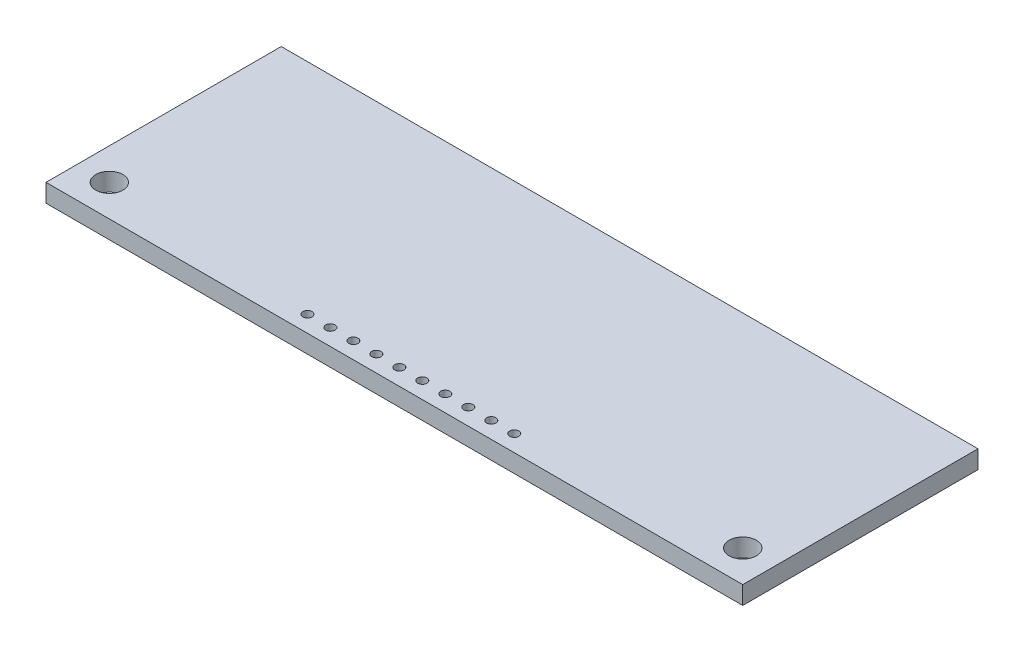
ISO-10303-21;
HEADER;
FILE_DESCRIPTION(('STEP AP214'),'2;1');
FILE_NAME('part.step','',(''),(''),'','','');
FILE_SCHEMA(('AUTOMOTIVE_DESIGN { 1 0 10303 214 1 1 1 1 }'));
ENDSEC;
DATA;
#1=APPLICATION_CONTEXT('core data for automotive mechanical design processes');
#2=APPLICATION_PROTOCOL_DEFINITION('international standard','automotive_design',2000,#1);
#3=PRODUCT_CONTEXT('',#1,'mechanical');
#4=PRODUCT('Part','Part','',(#3));
#5=PRODUCT_RELATED_PRODUCT_CATEGORY('part','',(#4));
#6=PRODUCT_DEFINITION_FORMATION('','',#4);
#7=PRODUCT_DEFINITION_CONTEXT('part definition',#1,'design');
#8=PRODUCT_DEFINITION('design','',#6,#7);
#9=PRODUCT_DEFINITION_SHAPE('','',#8);
#10=(LENGTH_UNIT() NAMED_UNIT(*) SI_UNIT(.MILLI.,.METRE.));
#11=(NAMED_UNIT(*) PLANE_ANGLE_UNIT() SI_UNIT($,.RADIAN.));
#12=(NAMED_UNIT(*) SI_UNIT($,.STERADIAN.) SOLID_ANGLE_UNIT());
#13=UNCERTAINTY_MEASURE_WITH_UNIT(LENGTH_MEASURE(1.E-05),#10,'distance_accuracy_value','');
#14=(GEOMETRIC_REPRESENTATION_CONTEXT(3) GLOBAL_UNCERTAINTY_ASSIGNED_CONTEXT((#13)) GLOBAL_UNIT_ASSIGNED_CONTEXT((#10,
#11,#12)) REPRESENTATION_CONTEXT('',''));
#15=CARTESIAN_POINT('',(0.,0.,0.));
#16=DIRECTION('',(0.,0.,1.));
#17=DIRECTION('',(1.,0.,0.));
#18=AXIS2_PLACEMENT_3D('',#15,#16,#17);
#19=CARTESIAN_POINT('',(0.,2.,26.));
#20=DIRECTION('',(1.,0.,0.));
#21=DIRECTION('',(0.,0.,-1.));
#22=AXIS2_PLACEMENT_3D('',#19,#20,#21);
#23=PLANE('',#22);
#24=DIRECTION('',(0.,0.,1.));
#25=VECTOR('',#24,1.);
#26=CARTESIAN_POINT('',(0.,0.,26.));
#27=LINE('',#26,#25);
#28=CARTESIAN_POINT('',(0.,0.,0.));
#29=VERTEX_POINT('',#28);
#30=CARTESIAN_POINT('',(0.,0.,26.));
#31=VERTEX_POINT('',#30);
#32=EDGE_CURVE('E102',#29,#31,#27,.T.);
#33=ORIENTED_EDGE('',*,*,#32,.T.);
#34=DIRECTION('',(0.,-1.,0.));
#35=VECTOR('',#34,1.);
#36=CARTESIAN_POINT('',(0.,2.,26.));
#37=LINE('',#36,#35);
#38=CARTESIAN_POINT('',(0.,2.,26.));
#39=VERTEX_POINT('',#38);
#40=EDGE_CURVE('E11',#39,#31,#37,.T.);
#41=ORIENTED_EDGE('',*,*,#40,.F.);
#42=DIRECTION('',(0.,0.,1.));
#43=VECTOR('',#42,1.);
#44=CARTESIAN_POINT('',(0.,2.,26.));
#45=LINE('',#44,#43);
#46=CARTESIAN_POINT('',(0.,2.,0.));
#47=VERTEX_POINT('',#46);
#48=EDGE_CURVE('E90',#47,#39,#45,.T.);
#49=ORIENTED_EDGE('',*,*,#48,.F.);
#50=DIRECTION('',(0.,-1.,0.));
#51=VECTOR('',#50,1.);
#52=CARTESIAN_POINT('',(0.,2.,0.));
#53=LINE('',#52,#51);
#54=EDGE_CURVE('E98',#47,#29,#53,.T.);
#55=ORIENTED_EDGE('',*,*,#54,.T.);
#56=EDGE_LOOP('',(#33,#41,#49,#55));
#57=FACE_BOUND('',#56,.T.);
#58=ADVANCED_FACE('F39',(#57),#23,.F.);
#59=CARTESIAN_POINT('',(77.,2.,26.));
#60=DIRECTION('',(0.,0.,-1.));
#61=DIRECTION('',(-1.,0.,0.));
#62=AXIS2_PLACEMENT_3D('',#59,#60,#61);
#63=PLANE('',#62);
#64=DIRECTION('',(1.,0.,0.));
#65=VECTOR('',#64,1.);
#66=CARTESIAN_POINT('',(77.,0.,26.));
#67=LINE('',#66,#65);
#68=CARTESIAN_POINT('',(77.,0.,26.));
#69=VERTEX_POINT('',#68);
#70=EDGE_CURVE('E94',#31,#69,#67,.T.);
#71=ORIENTED_EDGE('',*,*,#70,.T.);
#72=DIRECTION('',(0.,-1.,0.));
#73=VECTOR('',#72,1.);
#74=CARTESIAN_POINT('',(77.,2.,26.));
#75=LINE('',#74,#73);
#76=CARTESIAN_POINT('',(77.,2.,26.));
#77=VERTEX_POINT('',#76);
#78=EDGE_CURVE('E47',#77,#69,#75,.T.);
#79=ORIENTED_EDGE('',*,*,#78,.F.);
#80=DIRECTION('',(1.,0.,0.));
#81=VECTOR('',#80,1.);
#82=CARTESIAN_POINT('',(77.,2.,26.));
#83=LINE('',#82,#81);
#84=EDGE_CURVE('E85',#39,#77,#83,.T.);
#85=ORIENTED_EDGE('',*,*,#84,.F.);
#86=ORIENTED_EDGE('',*,*,#40,.T.);
#87=EDGE_LOOP('',(#71,#79,#85,#86));
#88=FACE_BOUND('',#87,.T.);
#89=ADVANCED_FACE('F93',(#88),#63,.F.);
#90=CARTESIAN_POINT('',(77.,2.,0.));
#91=DIRECTION('',(-1.,0.,0.));
#92=DIRECTION('',(0.,0.,1.));
#93=AXIS2_PLACEMENT_3D('',#90,#91,#92);
#94=PLANE('',#93);
#95=DIRECTION('',(0.,0.,-1.));
#96=VECTOR('',#95,1.);
#97=CARTESIAN_POINT('',(77.,0.,0.));
#98=LINE('',#97,#96);
#99=CARTESIAN_POINT('',(77.,0.,0.));
#100=VERTEX_POINT('',#99);
#101=EDGE_CURVE('E72',#69,#100,#98,.T.);
#102=ORIENTED_EDGE('',*,*,#101,.T.);
#103=DIRECTION('',(0.,-1.,0.));
#104=VECTOR('',#103,1.);
#105=CARTESIAN_POINT('',(77.,2.,0.));
#106=LINE('',#105,#104);
#107=CARTESIAN_POINT('',(77.,2.,0.));
#108=VERTEX_POINT('',#107);
#109=EDGE_CURVE('E95',#108,#100,#106,.T.);
#110=ORIENTED_EDGE('',*,*,#109,.F.);
#111=DIRECTION('',(0.,0.,-1.));
#112=VECTOR('',#111,1.);
#113=CARTESIAN_POINT('',(77.,2.,0.));
#114=LINE('',#113,#112);
#115=EDGE_CURVE('E88',#77,#108,#114,.T.);
#116=ORIENTED_EDGE('',*,*,#115,.F.);
#117=ORIENTED_EDGE('',*,*,#78,.T.);
#118=EDGE_LOOP('',(#102,#110,#116,#117));
#119=FACE_BOUND('',#118,.T.);
#120=ADVANCED_FACE('F96',(#119),#94,.F.);
#121=CARTESIAN_POINT('',(0.,2.,0.));
#122=DIRECTION('',(0.,0.,1.));
#123=DIRECTION('',(1.,0.,0.));
#124=AXIS2_PLACEMENT_3D('',#121,#122,#123);
#125=PLANE('',#124);
#126=DIRECTION('',(-1.,0.,0.));
#127=VECTOR('',#126,1.);
#128=CARTESIAN_POINT('',(0.,0.,0.));
#129=LINE('',#128,#127);
#130=EDGE_CURVE('E78',#100,#29,#129,.T.);
#131=ORIENTED_EDGE('',*,*,#130,.T.);
#132=ORIENTED_EDGE('',*,*,#54,.F.);
#133=DIRECTION('',(-1.,0.,0.));
#134=VECTOR('',#133,1.);
#135=CARTESIAN_POINT('',(0.,2.,0.));
#136=LINE('',#135,#134);
#137=EDGE_CURVE('E55',#108,#47,#136,.T.);
#138=ORIENTED_EDGE('',*,*,#137,.F.);
#139=ORIENTED_EDGE('',*,*,#109,.T.);
#140=EDGE_LOOP('',(#131,#132,#138,#139));
#141=FACE_BOUND('',#140,.T.);
#142=ADVANCED_FACE('F110',(#141),#125,.F.);
#143=CARTESIAN_POINT('',(0.,2.,0.));
#144=DIRECTION('',(0.,-1.,0.));
#145=DIRECTION('',(0.,0.,-1.));
#146=AXIS2_PLACEMENT_3D('',#143,#144,#145);
#147=PLANE('',#146);
#148=CARTESIAN_POINT('',(27.07,2.,24.1796600292399));
#149=DIRECTION('',(0.,1.,0.));
#150=DIRECTION('',(0.,0.,1.));
#151=AXIS2_PLACEMENT_3D('',#148,#149,#150);
#152=CIRCLE('',#151,0.509999999999999);
#153=CARTESIAN_POINT('',(27.07,2.,24.6896600292399));
#154=VERTEX_POINT('',#153);
#155=EDGE_CURVE('E182',#154,#154,#152,.T.);
#156=ORIENTED_EDGE('',*,*,#155,.F.);
#157=EDGE_LOOP('',(#156));
#158=FACE_BOUND('',#157,.T.);
#159=CARTESIAN_POINT('',(29.61,2.,24.1796600292399));
#160=DIRECTION('',(0.,1.,0.));
#161=DIRECTION('',(0.,0.,1.));
#162=AXIS2_PLACEMENT_3D('',#159,#160,#161);
#163=CIRCLE('',#162,0.509999999999995);
#164=CARTESIAN_POINT('',(29.61,2.,24.6896600292399));
#165=VERTEX_POINT('',#164);
#166=EDGE_CURVE('E176',#165,#165,#163,.T.);
#167=ORIENTED_EDGE('',*,*,#166,.F.);
#168=EDGE_LOOP('',(#167));
#169=FACE_BOUND('',#168,.T.);
#170=CARTESIAN_POINT('',(32.15,2.,24.1796600292399));
#171=DIRECTION('',(0.,1.,0.));
#172=DIRECTION('',(0.,0.,1.));
#173=AXIS2_PLACEMENT_3D('',#170,#171,#172);
#174=CIRCLE('',#173,0.509999999999995);
#175=CARTESIAN_POINT('',(32.15,2.,24.6896600292399));
#176=VERTEX_POINT('',#175);
#177=EDGE_CURVE('E170',#176,#176,#174,.T.);
#178=ORIENTED_EDGE('',*,*,#177,.F.);
#179=EDGE_LOOP('',(#178));
#180=FACE_BOUND('',#179,.T.);
#181=CARTESIAN_POINT('',(34.69,2.,24.1796600292399));
#182=DIRECTION('',(0.,1.,0.));
#183=DIRECTION('',(0.,0.,1.));
#184=AXIS2_PLACEMENT_3D('',#181,#182,#183);
#185=CIRCLE('',#184,0.510000000000003);
#186=CARTESIAN_POINT('',(34.69,2.,24.6896600292399));
#187=VERTEX_POINT('',#186);
#188=EDGE_CURVE('E164',#187,#187,#185,.T.);
#189=ORIENTED_EDGE('',*,*,#188,.F.);
#190=EDGE_LOOP('',(#189));
#191=FACE_BOUND('',#190,.T.);
#192=CARTESIAN_POINT('',(37.23,2.,24.1796600292399));
#193=DIRECTION('',(0.,1.,0.));
#194=DIRECTION('',(0.,0.,1.));
#195=AXIS2_PLACEMENT_3D('',#192,#193,#194);
#196=CIRCLE('',#195,0.509999999999995);
#197=CARTESIAN_POINT('',(37.23,2.,24.6896600292399));
#198=VERTEX_POINT('',#197);
#199=EDGE_CURVE('E158',#198,#198,#196,.T.);
#200=ORIENTED_EDGE('',*,*,#199,.F.);
#201=EDGE_LOOP('',(#200));
#202=FACE_BOUND('',#201,.T.);
#203=CARTESIAN_POINT('',(39.77,2.,24.1796600292399));
#204=DIRECTION('',(0.,1.,0.));
#205=DIRECTION('',(0.,0.,1.));
#206=AXIS2_PLACEMENT_3D('',#203,#204,#205);
#207=CIRCLE('',#206,0.509999999999995);
#208=CARTESIAN_POINT('',(39.77,2.,24.6896600292399));
#209=VERTEX_POINT('',#208);
#210=EDGE_CURVE('E152',#209,#209,#207,.T.);
#211=ORIENTED_EDGE('',*,*,#210,.F.);
#212=EDGE_LOOP('',(#211));
#213=FACE_BOUND('',#212,.T.);
#214=CARTESIAN_POINT('',(42.31,2.,24.1796600292399));
#215=DIRECTION('',(0.,1.,0.));
#216=DIRECTION('',(0.,0.,1.));
#217=AXIS2_PLACEMENT_3D('',#214,#215,#216);
#218=CIRCLE('',#217,0.510000000000003);
#219=CARTESIAN_POINT('',(42.31,2.,24.6896600292399));
#220=VERTEX_POINT('',#219);
#221=EDGE_CURVE('E146',#220,#220,#218,.T.);
#222=ORIENTED_EDGE('',*,*,#221,.F.);
#223=EDGE_LOOP('',(#222));
#224=FACE_BOUND('',#223,.T.);
#225=CARTESIAN_POINT('',(44.85,2.,24.1796600292399));
#226=DIRECTION('',(0.,1.,0.));
#227=DIRECTION('',(0.,0.,1.));
#228=AXIS2_PLACEMENT_3D('',#225,#226,#227);
#229=CIRCLE('',#228,0.509999999999995);
#230=CARTESIAN_POINT('',(44.85,2.,24.6896600292399));
#231=VERTEX_POINT('',#230);
#232=EDGE_CURVE('E140',#231,#231,#229,.T.);
#233=ORIENTED_EDGE('',*,*,#232,.F.);
#234=EDGE_LOOP('',(#233));
#235=FACE_BOUND('',#234,.T.);
#236=CARTESIAN_POINT('',(47.39,2.,24.1796600292399));
#237=DIRECTION('',(0.,1.,0.));
#238=DIRECTION('',(0.,0.,1.));
#239=AXIS2_PLACEMENT_3D('',#236,#237,#238);
#240=CIRCLE('',#239,0.509999999999995);
#241=CARTESIAN_POINT('',(47.39,2.,24.6896600292399));
#242=VERTEX_POINT('',#241);
#243=EDGE_CURVE('E134',#242,#242,#240,.T.);
#244=ORIENTED_EDGE('',*,*,#243,.F.);
#245=EDGE_LOOP('',(#244));
#246=FACE_BOUND('',#245,.T.);
#247=CARTESIAN_POINT('',(49.93,2.,24.1796600292399));
#248=DIRECTION('',(0.,1.,0.));
#249=DIRECTION('',(0.,0.,1.));
#250=AXIS2_PLACEMENT_3D('',#247,#248,#249);
#251=CIRCLE('',#250,0.509999999999995);
#252=CARTESIAN_POINT('',(49.93,2.,24.6896600292399));
#253=VERTEX_POINT('',#252);
#254=EDGE_CURVE('E128',#253,#253,#251,.T.);
#255=ORIENTED_EDGE('',*,*,#254,.F.);
#256=EDGE_LOOP('',(#255));
#257=FACE_BOUND('',#256,.T.);
#258=CARTESIAN_POINT('',(3.5,2.,22.5));
#259=DIRECTION('',(0.,1.,0.));
#260=DIRECTION('',(0.,0.,1.));
#261=AXIS2_PLACEMENT_3D('',#258,#259,#260);
#262=CIRCLE('',#261,1.5);
#263=CARTESIAN_POINT('',(3.5,2.,24.));
#264=VERTEX_POINT('',#263);
#265=EDGE_CURVE('E123',#264,#264,#262,.T.);
#266=ORIENTED_EDGE('',*,*,#265,.F.);
#267=EDGE_LOOP('',(#266));
#268=FACE_BOUND('',#267,.T.);
#269=CARTESIAN_POINT('',(73.5,2.,22.5));
#270=DIRECTION('',(0.,1.,0.));
#271=DIRECTION('',(0.,0.,1.));
#272=AXIS2_PLACEMENT_3D('',#269,#270,#271);
#273=CIRCLE('',#272,1.5);
#274=CARTESIAN_POINT('',(73.5,2.,24.));
#275=VERTEX_POINT('',#274);
#276=EDGE_CURVE('E116',#275,#275,#273,.T.);
#277=ORIENTED_EDGE('',*,*,#276,.F.);
#278=EDGE_LOOP('',(#277));
#279=FACE_BOUND('',#278,.T.);
#280=ORIENTED_EDGE('',*,*,#48,.T.);
#281=ORIENTED_EDGE('',*,*,#84,.T.);
#282=ORIENTED_EDGE('',*,*,#115,.T.);
#283=ORIENTED_EDGE('',*,*,#137,.T.);
#284=EDGE_LOOP('',(#280,#281,#282,#283));
#285=FACE_BOUND('',#284,.T.);
#286=ADVANCED_FACE('F86',(#158,#169,#180,#191,#202,#213,#224,#235,#246,#257,#268,#279,#285),
#147,.F.);
#287=CARTESIAN_POINT('',(0.,0.,0.));
#288=DIRECTION('',(0.,-1.,0.));
#289=DIRECTION('',(0.,0.,-1.));
#290=AXIS2_PLACEMENT_3D('',#287,#288,#289);
#291=PLANE('',#290);
#292=CARTESIAN_POINT('',(27.07,0.,24.1796600292399));
#293=DIRECTION('',(0.,1.,0.));
#294=DIRECTION('',(0.,0.,1.));
#295=AXIS2_PLACEMENT_3D('',#292,#293,#294);
#296=CIRCLE('',#295,0.509999999999999);
#297=CARTESIAN_POINT('',(27.07,0.,24.6896600292399));
#298=VERTEX_POINT('',#297);
#299=EDGE_CURVE('E120',#298,#298,#296,.T.);
#300=ORIENTED_EDGE('',*,*,#299,.T.);
#301=EDGE_LOOP('',(#300));
#302=FACE_BOUND('',#301,.T.);
#303=CARTESIAN_POINT('',(29.61,0.,24.1796600292399));
#304=DIRECTION('',(0.,1.,0.));
#305=DIRECTION('',(0.,0.,1.));
#306=AXIS2_PLACEMENT_3D('',#303,#304,#305);
#307=CIRCLE('',#306,0.509999999999995);
#308=CARTESIAN_POINT('',(29.61,0.,24.6896600292399));
#309=VERTEX_POINT('',#308);
#310=EDGE_CURVE('E179',#309,#309,#307,.T.);
#311=ORIENTED_EDGE('',*,*,#310,.T.);
#312=EDGE_LOOP('',(#311));
#313=FACE_BOUND('',#312,.T.);
#314=CARTESIAN_POINT('',(32.15,0.,24.1796600292399));
#315=DIRECTION('',(0.,1.,0.));
#316=DIRECTION('',(0.,0.,1.));
#317=AXIS2_PLACEMENT_3D('',#314,#315,#316);
#318=CIRCLE('',#317,0.509999999999995);
#319=CARTESIAN_POINT('',(32.15,0.,24.6896600292399));
#320=VERTEX_POINT('',#319);
#321=EDGE_CURVE('E173',#320,#320,#318,.T.);
#322=ORIENTED_EDGE('',*,*,#321,.T.);
#323=EDGE_LOOP('',(#322));
#324=FACE_BOUND('',#323,.T.);
#325=CARTESIAN_POINT('',(34.69,0.,24.1796600292399));
#326=DIRECTION('',(0.,1.,0.));
#327=DIRECTION('',(0.,0.,1.));
#328=AXIS2_PLACEMENT_3D('',#325,#326,#327);
#329=CIRCLE('',#328,0.510000000000003);
#330=CARTESIAN_POINT('',(34.69,0.,24.6896600292399));
#331=VERTEX_POINT('',#330);
#332=EDGE_CURVE('E167',#331,#331,#329,.T.);
#333=ORIENTED_EDGE('',*,*,#332,.T.);
#334=EDGE_LOOP('',(#333));
#335=FACE_BOUND('',#334,.T.);
#336=CARTESIAN_POINT('',(37.23,0.,24.1796600292399));
#337=DIRECTION('',(0.,1.,0.));
#338=DIRECTION('',(0.,0.,1.));
#339=AXIS2_PLACEMENT_3D('',#336,#337,#338);
#340=CIRCLE('',#339,0.509999999999995);
#341=CARTESIAN_POINT('',(37.23,0.,24.6896600292399));
#342=VERTEX_POINT('',#341);
#343=EDGE_CURVE('E161',#342,#342,#340,.T.);
#344=ORIENTED_EDGE('',*,*,#343,.T.);
#345=EDGE_LOOP('',(#344));
#346=FACE_BOUND('',#345,.T.);
#347=CARTESIAN_POINT('',(39.77,0.,24.1796600292399));
#348=DIRECTION('',(0.,1.,0.));
#349=DIRECTION('',(0.,0.,1.));
#350=AXIS2_PLACEMENT_3D('',#347,#348,#349);
#351=CIRCLE('',#350,0.509999999999995);
#352=CARTESIAN_POINT('',(39.77,0.,24.6896600292399));
#353=VERTEX_POINT('',#352);
#354=EDGE_CURVE('E155',#353,#353,#351,.T.);
#355=ORIENTED_EDGE('',*,*,#354,.T.);
#356=EDGE_LOOP('',(#355));
#357=FACE_BOUND('',#356,.T.);
#358=CARTESIAN_POINT('',(42.31,0.,24.1796600292399));
#359=DIRECTION('',(0.,1.,0.));
#360=DIRECTION('',(0.,0.,1.));
#361=AXIS2_PLACEMENT_3D('',#358,#359,#360);
#362=CIRCLE('',#361,0.510000000000003);
#363=CARTESIAN_POINT('',(42.31,0.,24.6896600292399));
#364=VERTEX_POINT('',#363);
#365=EDGE_CURVE('E149',#364,#364,#362,.T.);
#366=ORIENTED_EDGE('',*,*,#365,.T.);
#367=EDGE_LOOP('',(#366));
#368=FACE_BOUND('',#367,.T.);
#369=CARTESIAN_POINT('',(44.85,0.,24.1796600292399));
#370=DIRECTION('',(0.,1.,0.));
#371=DIRECTION('',(0.,0.,1.));
#372=AXIS2_PLACEMENT_3D('',#369,#370,#371);
#373=CIRCLE('',#372,0.509999999999995);
#374=CARTESIAN_POINT('',(44.85,0.,24.6896600292399));
#375=VERTEX_POINT('',#374);
#376=EDGE_CURVE('E143',#375,#375,#373,.T.);
#377=ORIENTED_EDGE('',*,*,#376,.T.);
#378=EDGE_LOOP('',(#377));
#379=FACE_BOUND('',#378,.T.);
#380=CARTESIAN_POINT('',(47.39,0.,24.1796600292399));
#381=DIRECTION('',(0.,1.,0.));
#382=DIRECTION('',(0.,0.,1.));
#383=AXIS2_PLACEMENT_3D('',#380,#381,#382);
#384=CIRCLE('',#383,0.509999999999995);
#385=CARTESIAN_POINT('',(47.39,0.,24.6896600292399));
#386=VERTEX_POINT('',#385);
#387=EDGE_CURVE('E137',#386,#386,#384,.T.);
#388=ORIENTED_EDGE('',*,*,#387,.T.);
#389=EDGE_LOOP('',(#388));
#390=FACE_BOUND('',#389,.T.);
#391=CARTESIAN_POINT('',(49.93,0.,24.1796600292399));
#392=DIRECTION('',(0.,1.,0.));
#393=DIRECTION('',(0.,0.,1.));
#394=AXIS2_PLACEMENT_3D('',#391,#392,#393);
#395=CIRCLE('',#394,0.509999999999995);
#396=CARTESIAN_POINT('',(49.93,0.,24.6896600292399));
#397=VERTEX_POINT('',#396);
#398=EDGE_CURVE('E131',#397,#397,#395,.T.);
#399=ORIENTED_EDGE('',*,*,#398,.T.);
#400=EDGE_LOOP('',(#399));
#401=FACE_BOUND('',#400,.T.);
#402=CARTESIAN_POINT('',(3.5,0.,22.5));
#403=DIRECTION('',(0.,1.,0.));
#404=DIRECTION('',(0.,0.,1.));
#405=AXIS2_PLACEMENT_3D('',#402,#403,#404);
#406=CIRCLE('',#405,1.5);
#407=CARTESIAN_POINT('',(3.5,0.,24.));
#408=VERTEX_POINT('',#407);
#409=EDGE_CURVE('E105',#408,#408,#406,.T.);
#410=ORIENTED_EDGE('',*,*,#409,.T.);
#411=EDGE_LOOP('',(#410));
#412=FACE_BOUND('',#411,.T.);
#413=CARTESIAN_POINT('',(73.5,0.,22.5));
#414=DIRECTION('',(0.,1.,0.));
#415=DIRECTION('',(0.,0.,1.));
#416=AXIS2_PLACEMENT_3D('',#413,#414,#415);
#417=CIRCLE('',#416,1.5);
#418=CARTESIAN_POINT('',(73.5,0.,24.));
#419=VERTEX_POINT('',#418);
#420=EDGE_CURVE('E119',#419,#419,#417,.T.);
#421=ORIENTED_EDGE('',*,*,#420,.T.);
#422=EDGE_LOOP('',(#421));
#423=FACE_BOUND('',#422,.T.);
#424=ORIENTED_EDGE('',*,*,#32,.F.);
#425=ORIENTED_EDGE('',*,*,#130,.F.);
#426=ORIENTED_EDGE('',*,*,#101,.F.);
#427=ORIENTED_EDGE('',*,*,#70,.F.);
#428=EDGE_LOOP('',(#424,#425,#426,#427));
#429=FACE_BOUND('',#428,.T.);
#430=ADVANCED_FACE('F113',(#302,#313,#324,#335,#346,#357,#368,#379,#390,#401,#412,#423,#429),
#291,.T.);
#431=CARTESIAN_POINT('',(73.5,0.,22.5));
#432=DIRECTION('',(0.,1.,0.));
#433=DIRECTION('',(0.,0.,1.));
#434=AXIS2_PLACEMENT_3D('',#431,#432,#433);
#435=CYLINDRICAL_SURFACE('',#434,1.5);
#436=ORIENTED_EDGE('',*,*,#420,.F.);
#437=EDGE_LOOP('',(#436));
#438=FACE_BOUND('',#437,.T.);
#439=ORIENTED_EDGE('',*,*,#276,.T.);
#440=EDGE_LOOP('',(#439));
#441=FACE_BOUND('',#440,.T.);
#442=ADVANCED_FACE('F222',(#438,#441),#435,.F.);
#443=CARTESIAN_POINT('',(3.5,0.,22.5));
#444=DIRECTION('',(0.,1.,0.));
#445=DIRECTION('',(0.,0.,1.));
#446=AXIS2_PLACEMENT_3D('',#443,#444,#445);
#447=CYLINDRICAL_SURFACE('',#446,1.5);
#448=ORIENTED_EDGE('',*,*,#409,.F.);
#449=EDGE_LOOP('',(#448));
#450=FACE_BOUND('',#449,.T.);
#451=ORIENTED_EDGE('',*,*,#265,.T.);
#452=EDGE_LOOP('',(#451));
#453=FACE_BOUND('',#452,.T.);
#454=ADVANCED_FACE('F224',(#450,#453),#447,.F.);
#455=CARTESIAN_POINT('',(49.93,0.,24.1796600292399));
#456=DIRECTION('',(0.,1.,0.));
#457=DIRECTION('',(0.,0.,1.));
#458=AXIS2_PLACEMENT_3D('',#455,#456,#457);
#459=CYLINDRICAL_SURFACE('',#458,0.509999999999995);
#460=ORIENTED_EDGE('',*,*,#398,.F.);
#461=EDGE_LOOP('',(#460));
#462=FACE_BOUND('',#461,.T.);
#463=ORIENTED_EDGE('',*,*,#254,.T.);
#464=EDGE_LOOP('',(#463));
#465=FACE_BOUND('',#464,.T.);
#466=ADVANCED_FACE('F231',(#462,#465),#459,.F.);
#467=CARTESIAN_POINT('',(47.39,0.,24.1796600292399));
#468=DIRECTION('',(0.,1.,0.));
#469=DIRECTION('',(0.,0.,1.));
#470=AXIS2_PLACEMENT_3D('',#467,#468,#469);
#471=CYLINDRICAL_SURFACE('',#470,0.509999999999995);
#472=ORIENTED_EDGE('',*,*,#387,.F.);
#473=EDGE_LOOP('',(#472));
#474=FACE_BOUND('',#473,.T.);
#475=ORIENTED_EDGE('',*,*,#243,.T.);
#476=EDGE_LOOP('',(#475));
#477=FACE_BOUND('',#476,.T.);
#478=ADVANCED_FACE('F270',(#474,#477),#471,.F.);
#479=CARTESIAN_POINT('',(44.85,0.,24.1796600292399));
#480=DIRECTION('',(0.,1.,0.));
#481=DIRECTION('',(0.,0.,1.));
#482=AXIS2_PLACEMENT_3D('',#479,#480,#481);
#483=CYLINDRICAL_SURFACE('',#482,0.509999999999995);
#484=ORIENTED_EDGE('',*,*,#376,.F.);
#485=EDGE_LOOP('',(#484));
#486=FACE_BOUND('',#485,.T.);
#487=ORIENTED_EDGE('',*,*,#232,.T.);
#488=EDGE_LOOP('',(#487));
#489=FACE_BOUND('',#488,.T.);
#490=ADVANCED_FACE('F282',(#486,#489),#483,.F.);
#491=CARTESIAN_POINT('',(42.31,0.,24.1796600292399));
#492=DIRECTION('',(0.,1.,0.));
#493=DIRECTION('',(0.,0.,1.));
#494=AXIS2_PLACEMENT_3D('',#491,#492,#493);
#495=CYLINDRICAL_SURFACE('',#494,0.510000000000003);
#496=ORIENTED_EDGE('',*,*,#365,.F.);
#497=EDGE_LOOP('',(#496));
#498=FACE_BOUND('',#497,.T.);
#499=ORIENTED_EDGE('',*,*,#221,.T.);
#500=EDGE_LOOP('',(#499));
#501=FACE_BOUND('',#500,.T.);
#502=ADVANCED_FACE('F293',(#498,#501),#495,.F.);
#503=CARTESIAN_POINT('',(39.77,0.,24.1796600292399));
#504=DIRECTION('',(0.,1.,0.));
#505=DIRECTION('',(0.,0.,1.));
#506=AXIS2_PLACEMENT_3D('',#503,#504,#505);
#507=CYLINDRICAL_SURFACE('',#506,0.509999999999995);
#508=ORIENTED_EDGE('',*,*,#354,.F.);
#509=EDGE_LOOP('',(#508));
#510=FACE_BOUND('',#509,.T.);
#511=ORIENTED_EDGE('',*,*,#210,.T.);
#512=EDGE_LOOP('',(#511));
#513=FACE_BOUND('',#512,.T.);
#514=ADVANCED_FACE('F304',(#510,#513),#507,.F.);
#515=CARTESIAN_POINT('',(37.23,0.,24.1796600292399));
#516=DIRECTION('',(0.,1.,0.));
#517=DIRECTION('',(0.,0.,1.));
#518=AXIS2_PLACEMENT_3D('',#515,#516,#517);
#519=CYLINDRICAL_SURFACE('',#518,0.509999999999995);
#520=ORIENTED_EDGE('',*,*,#343,.F.);
#521=EDGE_LOOP('',(#520));
#522=FACE_BOUND('',#521,.T.);
#523=ORIENTED_EDGE('',*,*,#199,.T.);
#524=EDGE_LOOP('',(#523));
#525=FACE_BOUND('',#524,.T.);
#526=ADVANCED_FACE('F315',(#522,#525),#519,.F.);
#527=CARTESIAN_POINT('',(34.69,0.,24.1796600292399));
#528=DIRECTION('',(0.,1.,0.));
#529=DIRECTION('',(0.,0.,1.));
#530=AXIS2_PLACEMENT_3D('',#527,#528,#529);
#531=CYLINDRICAL_SURFACE('',#530,0.510000000000003);
#532=ORIENTED_EDGE('',*,*,#332,.F.);
#533=EDGE_LOOP('',(#532));
#534=FACE_BOUND('',#533,.T.);
#535=ORIENTED_EDGE('',*,*,#188,.T.);
#536=EDGE_LOOP('',(#535));
#537=FACE_BOUND('',#536,.T.);
#538=ADVANCED_FACE('F326',(#534,#537),#531,.F.);
#539=CARTESIAN_POINT('',(32.15,0.,24.1796600292399));
#540=DIRECTION('',(0.,1.,0.));
#541=DIRECTION('',(0.,0.,1.));
#542=AXIS2_PLACEMENT_3D('',#539,#540,#541);
#543=CYLINDRICAL_SURFACE('',#542,0.509999999999995);
#544=ORIENTED_EDGE('',*,*,#321,.F.);
#545=EDGE_LOOP('',(#544));
#546=FACE_BOUND('',#545,.T.);
#547=ORIENTED_EDGE('',*,*,#177,.T.);
#548=EDGE_LOOP('',(#547));
#549=FACE_BOUND('',#548,.T.);
#550=ADVANCED_FACE('F337',(#546,#549),#543,.F.);
#551=CARTESIAN_POINT('',(29.61,0.,24.1796600292399));
#552=DIRECTION('',(0.,1.,0.));
#553=DIRECTION('',(0.,0.,1.));
#554=AXIS2_PLACEMENT_3D('',#551,#552,#553);
#555=CYLINDRICAL_SURFACE('',#554,0.509999999999995);
#556=ORIENTED_EDGE('',*,*,#310,.F.);
#557=EDGE_LOOP('',(#556));
#558=FACE_BOUND('',#557,.T.);
#559=ORIENTED_EDGE('',*,*,#166,.T.);
#560=EDGE_LOOP('',(#559));
#561=FACE_BOUND('',#560,.T.);
#562=ADVANCED_FACE('F193',(#558,#561),#555,.F.);
#563=CARTESIAN_POINT('',(27.07,0.,24.1796600292399));
#564=DIRECTION('',(0.,1.,0.));
#565=DIRECTION('',(0.,0.,1.));
#566=AXIS2_PLACEMENT_3D('',#563,#564,#565);
#567=CYLINDRICAL_SURFACE('',#566,0.509999999999999);
#568=ORIENTED_EDGE('',*,*,#299,.F.);
#569=EDGE_LOOP('',(#568));
#570=FACE_BOUND('',#569,.T.);
#571=ORIENTED_EDGE('',*,*,#155,.T.);
#572=EDGE_LOOP('',(#571));
#573=FACE_BOUND('',#572,.T.);
#574=ADVANCED_FACE('F190',(#570,#573),#567,.F.);
#575=CLOSED_SHELL('',(#58,#89,#120,#142,#286,#430,#442,#454,#466,#478,#490,#502,#514,#526,#538,
#550,#562,#574));
#576=MANIFOLD_SOLID_BREP('B2',#575);
#577=ADVANCED_BREP_SHAPE_REPRESENTATION('',(#18,#576),#14);
#578=SHAPE_DEFINITION_REPRESENTATION(#9,#577);
ENDSEC;
END-ISO-10303-21;
